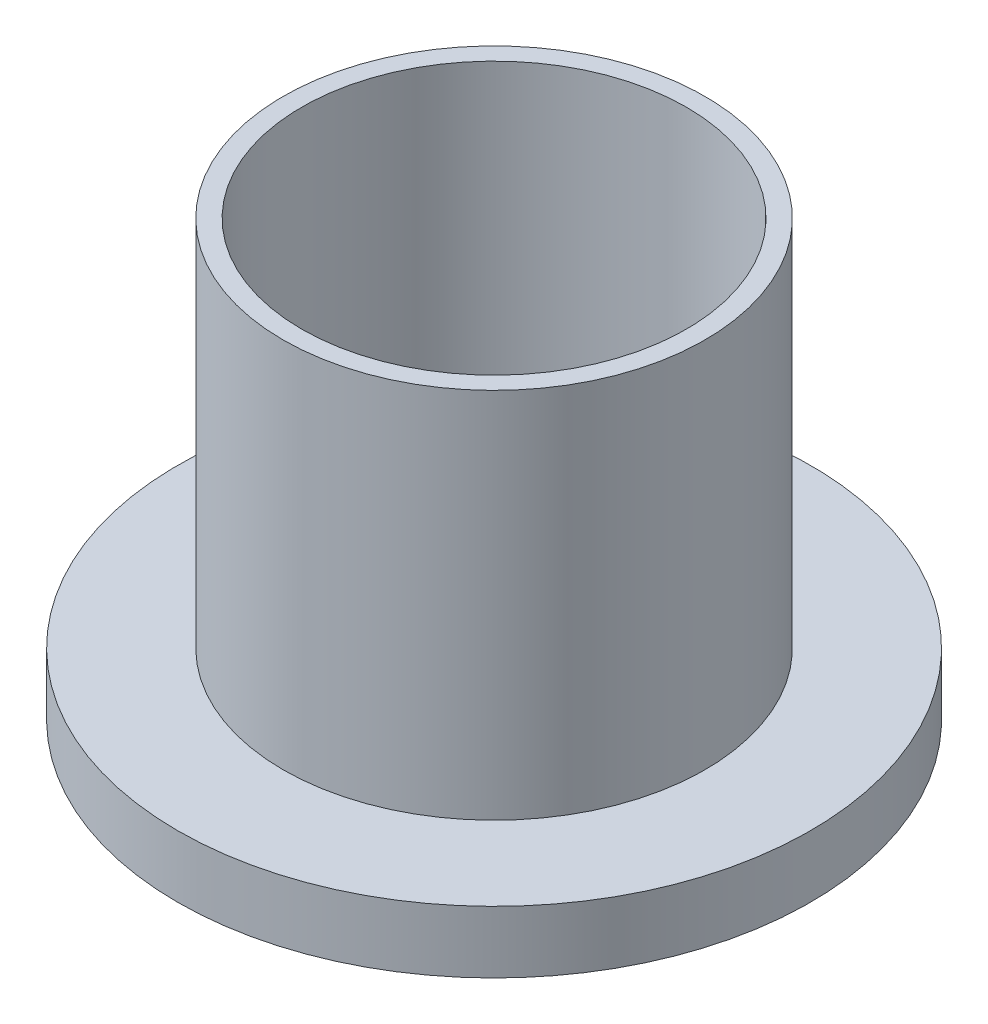
ISO-10303-21;
HEADER;
FILE_DESCRIPTION(('STEP AP214'),'2;1');
FILE_NAME('part.step','',(''),(''),'','','');
FILE_SCHEMA(('AUTOMOTIVE_DESIGN { 1 0 10303 214 1 1 1 1 }'));
ENDSEC;
DATA;
#1=APPLICATION_CONTEXT('core data for automotive mechanical design processes');
#2=APPLICATION_PROTOCOL_DEFINITION('international standard','automotive_design',2000,#1);
#3=PRODUCT_CONTEXT('',#1,'mechanical');
#4=PRODUCT('Part','Part','',(#3));
#5=PRODUCT_RELATED_PRODUCT_CATEGORY('part','',(#4));
#6=PRODUCT_DEFINITION_FORMATION('','',#4);
#7=PRODUCT_DEFINITION_CONTEXT('part definition',#1,'design');
#8=PRODUCT_DEFINITION('design','',#6,#7);
#9=PRODUCT_DEFINITION_SHAPE('','',#8);
#10=(LENGTH_UNIT() NAMED_UNIT(*) SI_UNIT(.MILLI.,.METRE.));
#11=(NAMED_UNIT(*) PLANE_ANGLE_UNIT() SI_UNIT($,.RADIAN.));
#12=(NAMED_UNIT(*) SI_UNIT($,.STERADIAN.) SOLID_ANGLE_UNIT());
#13=UNCERTAINTY_MEASURE_WITH_UNIT(LENGTH_MEASURE(1.E-05),#10,'distance_accuracy_value','');
#14=(GEOMETRIC_REPRESENTATION_CONTEXT(3) GLOBAL_UNCERTAINTY_ASSIGNED_CONTEXT((#13)) GLOBAL_UNIT_ASSIGNED_CONTEXT((#10,
#11,#12)) REPRESENTATION_CONTEXT('',''));
#15=CARTESIAN_POINT('',(0.,0.,0.));
#16=DIRECTION('',(0.,0.,1.));
#17=DIRECTION('',(1.,0.,0.));
#18=AXIS2_PLACEMENT_3D('',#15,#16,#17);
#19=CARTESIAN_POINT('',(0.,1.,0.));
#20=DIRECTION('',(0.,1.,0.));
#21=DIRECTION('',(0.,0.,1.));
#22=AXIS2_PLACEMENT_3D('',#19,#20,#21);
#23=PLANE('',#22);
#24=CARTESIAN_POINT('',(0.,1.,0.));
#25=DIRECTION('',(0.,1.,0.));
#26=DIRECTION('',(0.,0.,1.));
#27=AXIS2_PLACEMENT_3D('',#24,#25,#26);
#28=CIRCLE('',#27,5.1);
#29=CARTESIAN_POINT('',(0.,1.,5.1));
#30=VERTEX_POINT('',#29);
#31=EDGE_CURVE('E10',#30,#30,#28,.T.);
#32=ORIENTED_EDGE('',*,*,#31,.T.);
#33=EDGE_LOOP('',(#32));
#34=FACE_BOUND('',#33,.T.);
#35=CARTESIAN_POINT('',(0.,1.,0.));
#36=DIRECTION('',(0.,1.,0.));
#37=DIRECTION('',(0.,0.,1.));
#38=AXIS2_PLACEMENT_3D('',#35,#36,#37);
#39=CIRCLE('',#38,3.4);
#40=CARTESIAN_POINT('',(0.,1.,3.4));
#41=VERTEX_POINT('',#40);
#42=EDGE_CURVE('E46',#41,#41,#39,.T.);
#43=ORIENTED_EDGE('',*,*,#42,.F.);
#44=EDGE_LOOP('',(#43));
#45=FACE_BOUND('',#44,.T.);
#46=ADVANCED_FACE('F30',(#34,#45),#23,.T.);
#47=CARTESIAN_POINT('',(0.,0.,0.));
#48=DIRECTION('',(0.,1.,0.));
#49=DIRECTION('',(0.,0.,1.));
#50=AXIS2_PLACEMENT_3D('',#47,#48,#49);
#51=PLANE('',#50);
#52=CARTESIAN_POINT('',(0.,0.,0.));
#53=DIRECTION('',(0.,1.,0.));
#54=DIRECTION('',(0.,0.,1.));
#55=AXIS2_PLACEMENT_3D('',#52,#53,#54);
#56=CIRCLE('',#55,5.1);
#57=CARTESIAN_POINT('',(0.,0.,5.1));
#58=VERTEX_POINT('',#57);
#59=EDGE_CURVE('E34',#58,#58,#56,.T.);
#60=ORIENTED_EDGE('',*,*,#59,.F.);
#61=EDGE_LOOP('',(#60));
#62=FACE_BOUND('',#61,.T.);
#63=CARTESIAN_POINT('',(0.,0.,0.));
#64=DIRECTION('',(0.,1.,0.));
#65=DIRECTION('',(0.,0.,1.));
#66=AXIS2_PLACEMENT_3D('',#63,#64,#65);
#67=CIRCLE('',#66,3.1);
#68=CARTESIAN_POINT('',(0.,0.,3.1));
#69=VERTEX_POINT('',#68);
#70=EDGE_CURVE('E41',#69,#69,#67,.T.);
#71=ORIENTED_EDGE('',*,*,#70,.T.);
#72=EDGE_LOOP('',(#71));
#73=FACE_BOUND('',#72,.T.);
#74=ADVANCED_FACE('F71',(#62,#73),#51,.F.);
#75=CARTESIAN_POINT('',(0.,1.,0.));
#76=DIRECTION('',(0.,-1.,0.));
#77=DIRECTION('',(0.,0.,-1.));
#78=AXIS2_PLACEMENT_3D('',#75,#76,#77);
#79=CYLINDRICAL_SURFACE('',#78,5.1);
#80=ORIENTED_EDGE('',*,*,#31,.F.);
#81=EDGE_LOOP('',(#80));
#82=FACE_BOUND('',#81,.T.);
#83=ORIENTED_EDGE('',*,*,#59,.T.);
#84=EDGE_LOOP('',(#83));
#85=FACE_BOUND('',#84,.T.);
#86=ADVANCED_FACE('F32',(#82,#85),#79,.T.);
#87=CARTESIAN_POINT('',(0.,1.,0.));
#88=DIRECTION('',(0.,-1.,0.));
#89=DIRECTION('',(0.,0.,-1.));
#90=AXIS2_PLACEMENT_3D('',#87,#88,#89);
#91=CYLINDRICAL_SURFACE('',#90,3.1);
#92=ORIENTED_EDGE('',*,*,#70,.F.);
#93=EDGE_LOOP('',(#92));
#94=FACE_BOUND('',#93,.T.);
#95=CARTESIAN_POINT('',(0.,7.,0.));
#96=DIRECTION('',(0.,1.,0.));
#97=DIRECTION('',(0.,0.,1.));
#98=AXIS2_PLACEMENT_3D('',#95,#96,#97);
#99=CIRCLE('',#98,3.1);
#100=CARTESIAN_POINT('',(0.,7.,3.1));
#101=VERTEX_POINT('',#100);
#102=EDGE_CURVE('E49',#101,#101,#99,.T.);
#103=ORIENTED_EDGE('',*,*,#102,.T.);
#104=EDGE_LOOP('',(#103));
#105=FACE_BOUND('',#104,.T.);
#106=ADVANCED_FACE('F55',(#94,#105),#91,.F.);
#107=CARTESIAN_POINT('',(0.,7.,0.));
#108=DIRECTION('',(0.,1.,0.));
#109=DIRECTION('',(0.,0.,1.));
#110=AXIS2_PLACEMENT_3D('',#107,#108,#109);
#111=PLANE('',#110);
#112=CARTESIAN_POINT('',(0.,7.,0.));
#113=DIRECTION('',(0.,1.,0.));
#114=DIRECTION('',(0.,0.,1.));
#115=AXIS2_PLACEMENT_3D('',#112,#113,#114);
#116=CIRCLE('',#115,3.4);
#117=CARTESIAN_POINT('',(0.,7.,3.4));
#118=VERTEX_POINT('',#117);
#119=EDGE_CURVE('E45',#118,#118,#116,.T.);
#120=ORIENTED_EDGE('',*,*,#119,.T.);
#121=EDGE_LOOP('',(#120));
#122=FACE_BOUND('',#121,.T.);
#123=ORIENTED_EDGE('',*,*,#102,.F.);
#124=EDGE_LOOP('',(#123));
#125=FACE_BOUND('',#124,.T.);
#126=ADVANCED_FACE('F57',(#122,#125),#111,.T.);
#127=CARTESIAN_POINT('',(0.,7.,0.));
#128=DIRECTION('',(0.,-1.,0.));
#129=DIRECTION('',(0.,0.,-1.));
#130=AXIS2_PLACEMENT_3D('',#127,#128,#129);
#131=CYLINDRICAL_SURFACE('',#130,3.4);
#132=ORIENTED_EDGE('',*,*,#119,.F.);
#133=EDGE_LOOP('',(#132));
#134=FACE_BOUND('',#133,.T.);
#135=ORIENTED_EDGE('',*,*,#42,.T.);
#136=EDGE_LOOP('',(#135));
#137=FACE_BOUND('',#136,.T.);
#138=ADVANCED_FACE('F59',(#134,#137),#131,.T.);
#139=CLOSED_SHELL('',(#46,#74,#86,#106,#126,#138));
#140=MANIFOLD_SOLID_BREP('B2',#139);
#141=ADVANCED_BREP_SHAPE_REPRESENTATION('',(#18,#140),#14);
#142=SHAPE_DEFINITION_REPRESENTATION(#9,#141);
ENDSEC;
END-ISO-10303-21;
